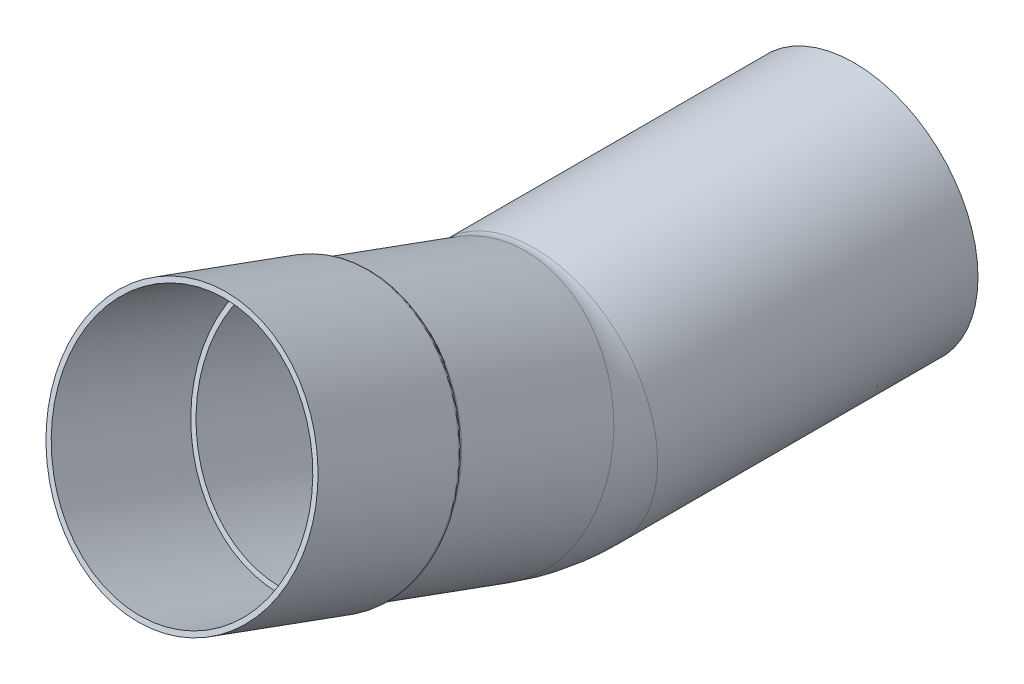
ISO-10303-21;
HEADER;
FILE_DESCRIPTION(('STEP AP214'),'2;1');
FILE_NAME('part.step','',(''),(''),'','','');
FILE_SCHEMA(('AUTOMOTIVE_DESIGN { 1 0 10303 214 1 1 1 1 }'));
ENDSEC;
DATA;
#1=APPLICATION_CONTEXT('core data for automotive mechanical design processes');
#2=APPLICATION_PROTOCOL_DEFINITION('international standard','automotive_design',2000,#1);
#3=PRODUCT_CONTEXT('',#1,'mechanical');
#4=PRODUCT('Part','Part','',(#3));
#5=PRODUCT_RELATED_PRODUCT_CATEGORY('part','',(#4));
#6=PRODUCT_DEFINITION_FORMATION('','',#4);
#7=PRODUCT_DEFINITION_CONTEXT('part definition',#1,'design');
#8=PRODUCT_DEFINITION('design','',#6,#7);
#9=PRODUCT_DEFINITION_SHAPE('','',#8);
#10=(LENGTH_UNIT() NAMED_UNIT(*) SI_UNIT(.MILLI.,.METRE.));
#11=(NAMED_UNIT(*) PLANE_ANGLE_UNIT() SI_UNIT($,.RADIAN.));
#12=(NAMED_UNIT(*) SI_UNIT($,.STERADIAN.) SOLID_ANGLE_UNIT());
#13=UNCERTAINTY_MEASURE_WITH_UNIT(LENGTH_MEASURE(1.E-05),#10,'distance_accuracy_value','');
#14=(GEOMETRIC_REPRESENTATION_CONTEXT(3) GLOBAL_UNCERTAINTY_ASSIGNED_CONTEXT((#13)) GLOBAL_UNIT_ASSIGNED_CONTEXT((#10,
#11,#12)) REPRESENTATION_CONTEXT('',''));
#15=CARTESIAN_POINT('',(0.,0.,0.));
#16=DIRECTION('',(0.,0.,1.));
#17=DIRECTION('',(1.,0.,0.));
#18=AXIS2_PLACEMENT_3D('',#15,#16,#17);
#19=CARTESIAN_POINT('',(0.,1.80922137642275,74.9707948785161));
#20=DIRECTION('',(0.,0.34202014332567,0.939692620785908));
#21=DIRECTION('',(0.,-0.939692620785908,0.34202014332567));
#22=AXIS2_PLACEMENT_3D('',#19,#20,#21);
#23=CYLINDRICAL_SURFACE('',#22,25.);
#24=CARTESIAN_POINT('',(0.,12.9967654463754,105.708319589865));
#25=DIRECTION('',(0.,0.34202014332567,0.939692620785908));
#26=DIRECTION('',(0.,-0.939692620785908,0.34202014332567));
#27=AXIS2_PLACEMENT_3D('',#24,#25,#26);
#28=CIRCLE('',#27,25.);
#29=CARTESIAN_POINT('',(0.,-10.4955500732723,114.258823173006));
#30=VERTEX_POINT('',#29);
#31=EDGE_CURVE('E54',#30,#30,#28,.F.);
#32=ORIENTED_EDGE('',*,*,#31,.T.);
#33=EDGE_LOOP('',(#32));
#34=FACE_BOUND('',#33,.T.);
#35=CARTESIAN_POINT('',(0.,1.80922137642275,74.9707948785161));
#36=DIRECTION('',(0.,0.342020143325669,0.939692620785908));
#37=DIRECTION('',(1.,0.,0.));
#38=AXIS2_PLACEMENT_3D('',#35,#36,#37);
#39=CIRCLE('',#38,25.);
#40=CARTESIAN_POINT('',(0.,-21.683094143225,83.5212984616579));
#41=VERTEX_POINT('',#40);
#42=EDGE_CURVE('E63',#41,#41,#39,.T.);
#43=ORIENTED_EDGE('',*,*,#42,.T.);
#44=EDGE_LOOP('',(#43));
#45=FACE_BOUND('',#44,.T.);
#46=ADVANCED_FACE('F43',(#34,#45),#23,.T.);
#47=CARTESIAN_POINT('',(0.,30.,64.7101905787461));
#48=DIRECTION('',(-1.,0.,0.));
#49=DIRECTION('',(0.,0.,1.));
#50=AXIS2_PLACEMENT_3D('',#47,#48,#49);
#51=TOROIDAL_SURFACE('',#50,30.,25.);
#52=CARTESIAN_POINT('',(0.,0.,64.7101905787461));
#53=DIRECTION('',(0.,0.,1.));
#54=DIRECTION('',(1.,0.,0.));
#55=AXIS2_PLACEMENT_3D('',#52,#53,#54);
#56=CIRCLE('',#55,25.);
#57=CARTESIAN_POINT('',(0.,-25.,64.7101905787461));
#58=VERTEX_POINT('',#57);
#59=EDGE_CURVE('E66',#58,#58,#56,.T.);
#60=CARTESIAN_POINT('',(0.,30.,64.7101905787461));
#61=DIRECTION('',(-1.,0.,0.));
#62=DIRECTION('',(0.,0.,1.));
#63=AXIS2_PLACEMENT_3D('',#60,#61,#62);
#64=CIRCLE('',#63,55.);
#65=EDGE_CURVE('',#58,#41,#64,.T.);
#66=ORIENTED_EDGE('',*,*,#59,.T.);
#67=ORIENTED_EDGE('',*,*,#42,.F.);
#68=ORIENTED_EDGE('',*,*,#65,.T.);
#69=ORIENTED_EDGE('',*,*,#65,.F.);
#70=EDGE_LOOP('',(#66,#68,#67,#69));
#71=FACE_BOUND('',#70,.T.);
#72=ADVANCED_FACE('F109',(#71),#51,.T.);
#73=CARTESIAN_POINT('',(0.,0.,64.7101905787461));
#74=DIRECTION('',(0.,0.,-1.));
#75=DIRECTION('',(0.,1.,0.));
#76=AXIS2_PLACEMENT_3D('',#73,#74,#75);
#77=CYLINDRICAL_SURFACE('',#76,25.);
#78=ORIENTED_EDGE('',*,*,#59,.F.);
#79=EDGE_LOOP('',(#78));
#80=FACE_BOUND('',#79,.T.);
#81=CARTESIAN_POINT('',(0.,0.,0.));
#82=DIRECTION('',(0.,0.,1.));
#83=DIRECTION('',(1.,0.,0.));
#84=AXIS2_PLACEMENT_3D('',#81,#82,#83);
#85=CIRCLE('',#84,25.);
#86=CARTESIAN_POINT('',(25.,0.,0.));
#87=VERTEX_POINT('',#86);
#88=EDGE_CURVE('E67',#87,#87,#85,.T.);
#89=ORIENTED_EDGE('',*,*,#88,.T.);
#90=EDGE_LOOP('',(#89));
#91=FACE_BOUND('',#90,.T.);
#92=ADVANCED_FACE('F115',(#80,#91),#77,.T.);
#93=CARTESIAN_POINT('',(0.,0.,0.));
#94=DIRECTION('',(0.,0.,1.));
#95=DIRECTION('',(1.,0.,0.));
#96=AXIS2_PLACEMENT_3D('',#93,#94,#95);
#97=PLANE('',#96);
#98=CARTESIAN_POINT('',(0.,0.,0.));
#99=DIRECTION('',(0.,0.,1.));
#100=DIRECTION('',(1.,0.,0.));
#101=AXIS2_PLACEMENT_3D('',#98,#99,#100);
#102=CIRCLE('',#101,24.);
#103=CARTESIAN_POINT('',(24.,0.,0.));
#104=VERTEX_POINT('',#103);
#105=EDGE_CURVE('E73',#104,#104,#102,.T.);
#106=ORIENTED_EDGE('',*,*,#105,.T.);
#107=EDGE_LOOP('',(#106));
#108=FACE_BOUND('',#107,.T.);
#109=ORIENTED_EDGE('',*,*,#88,.F.);
#110=EDGE_LOOP('',(#109));
#111=FACE_BOUND('',#110,.T.);
#112=ADVANCED_FACE('F178',(#108,#111),#97,.F.);
#113=CARTESIAN_POINT('',(0.,1.80922137642275,74.9707948785161));
#114=DIRECTION('',(0.,0.34202014332567,0.939692620785908));
#115=DIRECTION('',(0.,-0.939692620785908,0.34202014332567));
#116=AXIS2_PLACEMENT_3D('',#113,#114,#115);
#117=CYLINDRICAL_SURFACE('',#116,24.);
#118=CARTESIAN_POINT('',(0.,1.80922137642275,74.9707948785161));
#119=DIRECTION('',(0.,0.34202014332567,0.939692620785908));
#120=DIRECTION('',(0.,-0.939692620785908,0.34202014332567));
#121=AXIS2_PLACEMENT_3D('',#118,#119,#120);
#122=CIRCLE('',#121,24.);
#123=CARTESIAN_POINT('',(0.,-20.7434015224391,83.1792783183322));
#124=VERTEX_POINT('',#123);
#125=EDGE_CURVE('E70',#124,#124,#122,.T.);
#126=ORIENTED_EDGE('',*,*,#125,.F.);
#127=EDGE_LOOP('',(#126));
#128=FACE_BOUND('',#127,.T.);
#129=CARTESIAN_POINT('',(0.,13.6808057330268,107.587704831436));
#130=DIRECTION('',(0.,0.34202014332567,0.939692620785908));
#131=DIRECTION('',(0.,-0.939692620785908,0.34202014332567));
#132=AXIS2_PLACEMENT_3D('',#129,#130,#131);
#133=CIRCLE('',#132,24.);
#134=CARTESIAN_POINT('',(0.,-8.87181716583502,115.796188271252));
#135=VERTEX_POINT('',#134);
#136=EDGE_CURVE('E77',#135,#135,#133,.T.);
#137=ORIENTED_EDGE('',*,*,#136,.T.);
#138=EDGE_LOOP('',(#137));
#139=FACE_BOUND('',#138,.T.);
#140=ADVANCED_FACE('F173',(#128,#139),#117,.F.);
#141=CARTESIAN_POINT('',(0.,30.,64.7101905787461));
#142=DIRECTION('',(-1.,0.,0.));
#143=DIRECTION('',(0.,0.,1.));
#144=AXIS2_PLACEMENT_3D('',#141,#142,#143);
#145=TOROIDAL_SURFACE('',#144,30.,24.);
#146=CARTESIAN_POINT('',(0.,0.,64.7101905787461));
#147=DIRECTION('',(0.,0.,-1.));
#148=DIRECTION('',(0.,1.,0.));
#149=AXIS2_PLACEMENT_3D('',#146,#147,#148);
#150=CIRCLE('',#149,24.);
#151=CARTESIAN_POINT('',(0.,-24.,64.7101905787461));
#152=VERTEX_POINT('',#151);
#153=EDGE_CURVE('E76',#152,#152,#150,.F.);
#154=CARTESIAN_POINT('',(0.,30.,64.7101905787461));
#155=DIRECTION('',(-1.,0.,0.));
#156=DIRECTION('',(0.,0.,1.));
#157=AXIS2_PLACEMENT_3D('',#154,#155,#156);
#158=CIRCLE('',#157,54.);
#159=EDGE_CURVE('',#152,#124,#158,.T.);
#160=ORIENTED_EDGE('',*,*,#153,.F.);
#161=ORIENTED_EDGE('',*,*,#125,.T.);
#162=ORIENTED_EDGE('',*,*,#159,.T.);
#163=ORIENTED_EDGE('',*,*,#159,.F.);
#164=EDGE_LOOP('',(#160,#162,#161,#163));
#165=FACE_BOUND('',#164,.T.);
#166=ADVANCED_FACE('F177',(#165),#145,.F.);
#167=CARTESIAN_POINT('',(0.,0.,64.7101905787461));
#168=DIRECTION('',(0.,0.,-1.));
#169=DIRECTION('',(0.,1.,0.));
#170=AXIS2_PLACEMENT_3D('',#167,#168,#169);
#171=CYLINDRICAL_SURFACE('',#170,24.);
#172=ORIENTED_EDGE('',*,*,#153,.T.);
#173=EDGE_LOOP('',(#172));
#174=FACE_BOUND('',#173,.T.);
#175=ORIENTED_EDGE('',*,*,#105,.F.);
#176=EDGE_LOOP('',(#175));
#177=FACE_BOUND('',#176,.T.);
#178=ADVANCED_FACE('F166',(#174,#177),#171,.F.);
#179=CARTESIAN_POINT('',(0.,13.6808057330268,107.587704831436));
#180=DIRECTION('',(0.,0.34202014332567,0.939692620785908));
#181=DIRECTION('',(0.,-0.939692620785908,0.34202014332567));
#182=AXIS2_PLACEMENT_3D('',#179,#180,#181);
#183=PLANE('',#182);
#184=CARTESIAN_POINT('',(0.,13.6808057330268,107.587704831436));
#185=DIRECTION('',(0.,0.34202014332567,0.939692620785908));
#186=DIRECTION('',(0.,-0.939692620785908,0.34202014332567));
#187=AXIS2_PLACEMENT_3D('',#184,#185,#186);
#188=CIRCLE('',#187,25.);
#189=CARTESIAN_POINT('',(0.,-9.81150978662093,116.138208414578));
#190=VERTEX_POINT('',#189);
#191=EDGE_CURVE('E58',#190,#190,#188,.F.);
#192=ORIENTED_EDGE('',*,*,#191,.F.);
#193=EDGE_LOOP('',(#192));
#194=FACE_BOUND('',#193,.T.);
#195=ORIENTED_EDGE('',*,*,#136,.F.);
#196=EDGE_LOOP('',(#195));
#197=FACE_BOUND('',#196,.T.);
#198=ADVANCED_FACE('F105',(#194,#197),#183,.T.);
#199=CARTESIAN_POINT('',(0.,13.6808057330268,107.587704831436));
#200=DIRECTION('',(0.,-0.34202014332567,-0.939692620785908));
#201=DIRECTION('',(0.,0.939692620785908,-0.34202014332567));
#202=AXIS2_PLACEMENT_3D('',#199,#200,#201);
#203=CYLINDRICAL_SURFACE('',#202,26.);
#204=CARTESIAN_POINT('',(0.,13.5891617118276,107.335914952564));
#205=DIRECTION('',(0.,-0.34202014332567,-0.939692620785908));
#206=DIRECTION('',(0.,0.939692620785908,-0.34202014332567));
#207=AXIS2_PLACEMENT_3D('',#204,#205,#206);
#208=CIRCLE('',#207,26.);
#209=CARTESIAN_POINT('',(0.,38.0211698522612,98.4433912260963));
#210=VERTEX_POINT('',#209);
#211=EDGE_CURVE('E50',#210,#210,#208,.F.);
#212=ORIENTED_EDGE('',*,*,#211,.T.);
#213=EDGE_LOOP('',(#212));
#214=FACE_BOUND('',#213,.T.);
#215=CARTESIAN_POINT('',(0.,23.9414100327969,135.778483455014));
#216=DIRECTION('',(0.,0.34202014332567,0.939692620785908));
#217=DIRECTION('',(0.,-0.939692620785908,0.34202014332567));
#218=AXIS2_PLACEMENT_3D('',#215,#216,#217);
#219=CIRCLE('',#218,26.);
#220=CARTESIAN_POINT('',(0.,-0.490598107636755,144.671007181481));
#221=VERTEX_POINT('',#220);
#222=EDGE_CURVE('E84',#221,#221,#219,.T.);
#223=ORIENTED_EDGE('',*,*,#222,.F.);
#224=EDGE_LOOP('',(#223));
#225=FACE_BOUND('',#224,.T.);
#226=ADVANCED_FACE('F96',(#214,#225),#203,.T.);
#227=CARTESIAN_POINT('',(0.,23.9414100327969,135.778483455014));
#228=DIRECTION('',(0.,0.34202014332567,0.939692620785908));
#229=DIRECTION('',(0.,-0.939692620785908,0.34202014332567));
#230=AXIS2_PLACEMENT_3D('',#227,#228,#229);
#231=PLANE('',#230);
#232=ORIENTED_EDGE('',*,*,#222,.T.);
#233=EDGE_LOOP('',(#232));
#234=FACE_BOUND('',#233,.T.);
#235=CARTESIAN_POINT('',(0.,23.9414100327969,135.778483455014));
#236=DIRECTION('',(0.,0.34202014332567,0.939692620785908));
#237=DIRECTION('',(1.,0.,0.));
#238=AXIS2_PLACEMENT_3D('',#235,#236,#237);
#239=CIRCLE('',#238,25.);
#240=CARTESIAN_POINT('',(25.,23.9414100327969,135.778483455014));
#241=VERTEX_POINT('',#240);
#242=EDGE_CURVE('E87',#241,#241,#239,.T.);
#243=ORIENTED_EDGE('',*,*,#242,.F.);
#244=EDGE_LOOP('',(#243));
#245=FACE_BOUND('',#244,.T.);
#246=ADVANCED_FACE('F94',(#234,#245),#231,.T.);
#247=CARTESIAN_POINT('',(0.,23.9414100327969,135.778483455014));
#248=DIRECTION('',(0.,-0.34202014332567,-0.939692620785908));
#249=DIRECTION('',(0.,0.939692620785908,-0.34202014332567));
#250=AXIS2_PLACEMENT_3D('',#247,#248,#249);
#251=CYLINDRICAL_SURFACE('',#250,25.);
#252=ORIENTED_EDGE('',*,*,#242,.T.);
#253=EDGE_LOOP('',(#252));
#254=FACE_BOUND('',#253,.T.);
#255=ORIENTED_EDGE('',*,*,#191,.T.);
#256=EDGE_LOOP('',(#255));
#257=FACE_BOUND('',#256,.T.);
#258=ADVANCED_FACE('F91',(#254,#257),#251,.F.);
#259=CARTESIAN_POINT('',(0.,12.9967654463754,105.708319589865));
#260=DIRECTION('',(0.,0.34202014332567,0.939692620785908));
#261=DIRECTION('',(0.,-0.939692620785908,0.34202014332567));
#262=AXIS2_PLACEMENT_3D('',#259,#260,#261);
#263=TOROIDAL_SURFACE('',#262,26.,1.);
#264=CARTESIAN_POINT('',(0.,13.2929635791017,106.522117271214));
#265=DIRECTION('',(0.,-0.34202014332567,-0.939692620785908));
#266=DIRECTION('',(0.,0.939692620785908,-0.34202014332567));
#267=AXIS2_PLACEMENT_3D('',#264,#265,#266);
#268=CIRCLE('',#267,25.4999999999999);
#269=CARTESIAN_POINT('',(0.,37.2551254091422,97.8006036164099));
#270=VERTEX_POINT('',#269);
#271=EDGE_CURVE('E11',#270,#270,#268,.T.);
#272=ORIENTED_EDGE('',*,*,#271,.T.);
#273=EDGE_LOOP('',(#272));
#274=FACE_BOUND('',#273,.T.);
#275=ORIENTED_EDGE('',*,*,#31,.F.);
#276=EDGE_LOOP('',(#275));
#277=FACE_BOUND('',#276,.T.);
#278=ADVANCED_FACE('F103',(#274,#277),#263,.F.);
#279=CARTESIAN_POINT('',(0.,13.5891617118276,107.335914952564));
#280=DIRECTION('',(0.,-0.34202014332567,-0.939692620785908));
#281=DIRECTION('',(0.,0.939692620785908,-0.34202014332567));
#282=AXIS2_PLACEMENT_3D('',#279,#280,#281);
#283=TOROIDAL_SURFACE('',#282,25.0000000000002,1.);
#284=ORIENTED_EDGE('',*,*,#271,.F.);
#285=EDGE_LOOP('',(#284));
#286=FACE_BOUND('',#285,.T.);
#287=ORIENTED_EDGE('',*,*,#211,.F.);
#288=EDGE_LOOP('',(#287));
#289=FACE_BOUND('',#288,.T.);
#290=ADVANCED_FACE('F45',(#286,#289),#283,.T.);
#291=CLOSED_SHELL('',(#46,#72,#92,#112,#140,#166,#178,#198,#226,#246,#258,#278,#290));
#292=MANIFOLD_SOLID_BREP('B2',#291);
#293=ADVANCED_BREP_SHAPE_REPRESENTATION('',(#18,#292),#14);
#294=SHAPE_DEFINITION_REPRESENTATION(#9,#293);
ENDSEC;
END-ISO-10303-21;
